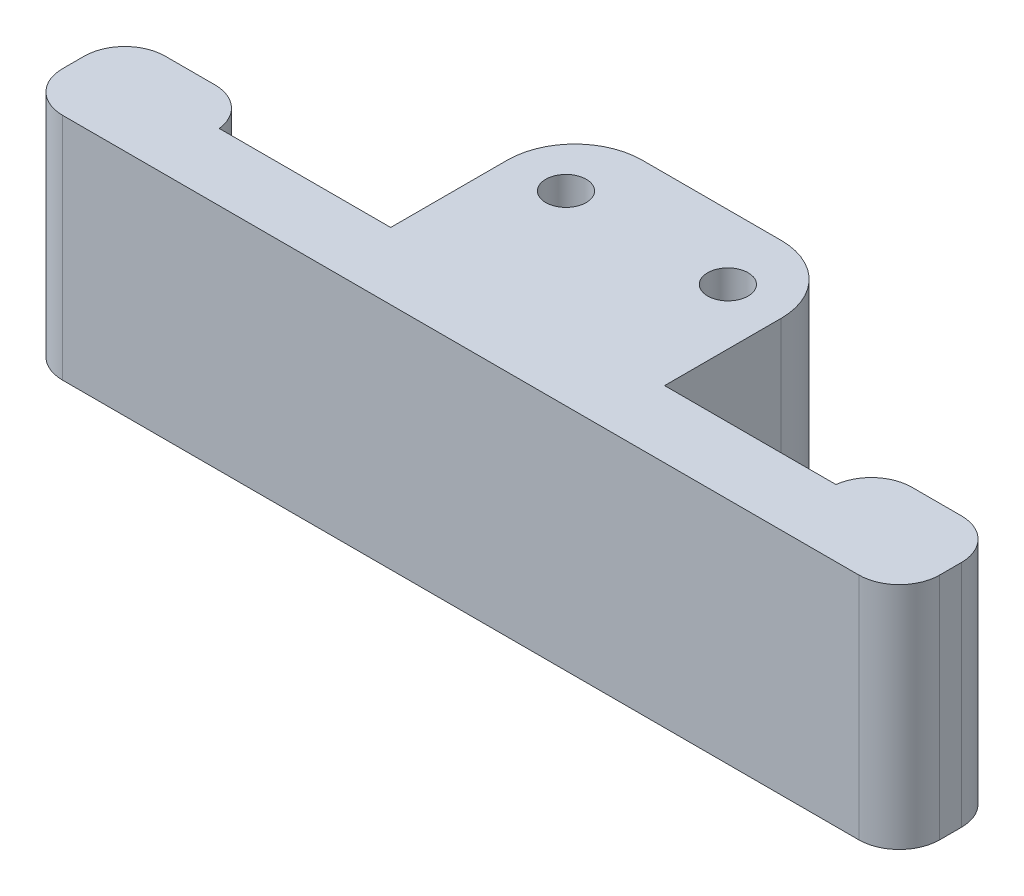
ISO-10303-21;
HEADER;
FILE_DESCRIPTION(('STEP AP214'),'2;1');
FILE_NAME('part.step','',(''),(''),'','','');
FILE_SCHEMA(('AUTOMOTIVE_DESIGN { 1 0 10303 214 1 1 1 1 }'));
ENDSEC;
DATA;
#1=APPLICATION_CONTEXT('core data for automotive mechanical design processes');
#2=APPLICATION_PROTOCOL_DEFINITION('international standard','automotive_design',2000,#1);
#3=PRODUCT_CONTEXT('',#1,'mechanical');
#4=PRODUCT('Part','Part','',(#3));
#5=PRODUCT_RELATED_PRODUCT_CATEGORY('part','',(#4));
#6=PRODUCT_DEFINITION_FORMATION('','',#4);
#7=PRODUCT_DEFINITION_CONTEXT('part definition',#1,'design');
#8=PRODUCT_DEFINITION('design','',#6,#7);
#9=PRODUCT_DEFINITION_SHAPE('','',#8);
#10=(LENGTH_UNIT() NAMED_UNIT(*) SI_UNIT(.MILLI.,.METRE.));
#11=(NAMED_UNIT(*) PLANE_ANGLE_UNIT() SI_UNIT($,.RADIAN.));
#12=(NAMED_UNIT(*) SI_UNIT($,.STERADIAN.) SOLID_ANGLE_UNIT());
#13=UNCERTAINTY_MEASURE_WITH_UNIT(LENGTH_MEASURE(1.E-05),#10,'distance_accuracy_value','');
#14=(GEOMETRIC_REPRESENTATION_CONTEXT(3) GLOBAL_UNCERTAINTY_ASSIGNED_CONTEXT((#13)) GLOBAL_UNIT_ASSIGNED_CONTEXT((#10,
#11,#12)) REPRESENTATION_CONTEXT('',''));
#15=CARTESIAN_POINT('',(0.,0.,0.));
#16=DIRECTION('',(0.,0.,1.));
#17=DIRECTION('',(1.,0.,0.));
#18=AXIS2_PLACEMENT_3D('',#15,#16,#17);
#19=CARTESIAN_POINT('',(0.,17.,0.));
#20=DIRECTION('',(0.,-1.,0.));
#21=DIRECTION('',(0.,0.,-1.));
#22=AXIS2_PLACEMENT_3D('',#19,#20,#21);
#23=PLANE('',#22);
#24=DIRECTION('',(0.,0.,1.));
#25=VECTOR('',#24,1.);
#26=CARTESIAN_POINT('',(-32.5,17.,6.19999999999999));
#27=LINE('',#26,#25);
#28=CARTESIAN_POINT('',(-32.5,17.,9.19999999999999));
#29=VERTEX_POINT('',#28);
#30=CARTESIAN_POINT('',(-32.5,17.,10.8));
#31=VERTEX_POINT('',#30);
#32=EDGE_CURVE('E218',#29,#31,#27,.T.);
#33=ORIENTED_EDGE('',*,*,#32,.T.);
#34=CARTESIAN_POINT('',(-29.5,17.,10.8));
#35=DIRECTION('',(0.,-1.,0.));
#36=DIRECTION('',(0.,0.,-1.));
#37=AXIS2_PLACEMENT_3D('',#34,#35,#36);
#38=CIRCLE('',#37,3.);
#39=CARTESIAN_POINT('',(-29.5,17.,13.8));
#40=VERTEX_POINT('',#39);
#41=EDGE_CURVE('E199',#31,#40,#38,.F.);
#42=ORIENTED_EDGE('',*,*,#41,.T.);
#43=DIRECTION('',(1.,0.,0.));
#44=VECTOR('',#43,1.);
#45=CARTESIAN_POINT('',(-32.5,17.,13.8));
#46=LINE('',#45,#44);
#47=CARTESIAN_POINT('',(29.5,17.,13.8));
#48=VERTEX_POINT('',#47);
#49=EDGE_CURVE('E305',#40,#48,#46,.T.);
#50=ORIENTED_EDGE('',*,*,#49,.T.);
#51=CARTESIAN_POINT('',(29.5,17.,10.8));
#52=DIRECTION('',(0.,-1.,0.));
#53=DIRECTION('',(0.,0.,-1.));
#54=AXIS2_PLACEMENT_3D('',#51,#52,#53);
#55=CIRCLE('',#54,3.);
#56=CARTESIAN_POINT('',(32.5,17.,10.8));
#57=VERTEX_POINT('',#56);
#58=EDGE_CURVE('E197',#48,#57,#55,.F.);
#59=ORIENTED_EDGE('',*,*,#58,.T.);
#60=DIRECTION('',(0.,0.,-1.));
#61=VECTOR('',#60,1.);
#62=CARTESIAN_POINT('',(32.5,17.,13.8));
#63=LINE('',#62,#61);
#64=CARTESIAN_POINT('',(32.5,17.,9.2));
#65=VERTEX_POINT('',#64);
#66=EDGE_CURVE('E303',#57,#65,#63,.T.);
#67=ORIENTED_EDGE('',*,*,#66,.T.);
#68=CARTESIAN_POINT('',(29.5,17.,9.19999999999999));
#69=DIRECTION('',(0.,-1.,0.));
#70=DIRECTION('',(0.,0.,-1.));
#71=AXIS2_PLACEMENT_3D('',#68,#69,#70);
#72=CIRCLE('',#71,3.);
#73=CARTESIAN_POINT('',(29.5,17.,6.19999999999999));
#74=VERTEX_POINT('',#73);
#75=EDGE_CURVE('E57',#65,#74,#72,.F.);
#76=ORIENTED_EDGE('',*,*,#75,.T.);
#77=DIRECTION('',(-1.,0.,0.));
#78=VECTOR('',#77,1.);
#79=CARTESIAN_POINT('',(32.5,17.,6.19999999999999));
#80=LINE('',#79,#78);
#81=CARTESIAN_POINT('',(25.8283216750378,17.,6.19999999999999));
#82=VERTEX_POINT('',#81);
#83=EDGE_CURVE('E301',#74,#82,#80,.T.);
#84=ORIENTED_EDGE('',*,*,#83,.T.);
#85=CARTESIAN_POINT('',(25.8283216750378,17.,9.19999999999999));
#86=DIRECTION('',(0.,-1.,0.));
#87=DIRECTION('',(0.,0.,-1.));
#88=AXIS2_PLACEMENT_3D('',#85,#86,#87);
#89=CIRCLE('',#88,3.);
#90=CARTESIAN_POINT('',(22.85,17.,8.83999999999999));
#91=VERTEX_POINT('',#90);
#92=EDGE_CURVE('E188',#82,#91,#89,.F.);
#93=ORIENTED_EDGE('',*,*,#92,.T.);
#94=DIRECTION('',(-1.,0.,0.));
#95=VECTOR('',#94,1.);
#96=CARTESIAN_POINT('',(22.85,17.,8.83999999999999));
#97=LINE('',#96,#95);
#98=CARTESIAN_POINT('',(10.15,17.,8.83999999999999));
#99=VERTEX_POINT('',#98);
#100=EDGE_CURVE('E299',#91,#99,#97,.T.);
#101=ORIENTED_EDGE('',*,*,#100,.T.);
#102=DIRECTION('',(0.,0.,-1.));
#103=VECTOR('',#102,1.);
#104=CARTESIAN_POINT('',(10.15,17.,8.83999999999999));
#105=LINE('',#104,#103);
#106=CARTESIAN_POINT('',(10.15,17.,0.199999999999995));
#107=VERTEX_POINT('',#106);
#108=EDGE_CURVE('E296',#99,#107,#105,.T.);
#109=ORIENTED_EDGE('',*,*,#108,.T.);
#110=CARTESIAN_POINT('',(5.15,17.,0.199999999999994));
#111=DIRECTION('',(0.,-1.,0.));
#112=DIRECTION('',(0.,0.,-1.));
#113=AXIS2_PLACEMENT_3D('',#110,#111,#112);
#114=CIRCLE('',#113,5.);
#115=CARTESIAN_POINT('',(5.15,17.,-4.80000000000001));
#116=VERTEX_POINT('',#115);
#117=EDGE_CURVE('E248',#107,#116,#114,.F.);
#118=ORIENTED_EDGE('',*,*,#117,.T.);
#119=DIRECTION('',(-1.,0.,0.));
#120=VECTOR('',#119,1.);
#121=CARTESIAN_POINT('',(10.15,17.,-4.80000000000001));
#122=LINE('',#121,#120);
#123=CARTESIAN_POINT('',(-5.15,17.,-4.80000000000001));
#124=VERTEX_POINT('',#123);
#125=EDGE_CURVE('E293',#116,#124,#122,.T.);
#126=ORIENTED_EDGE('',*,*,#125,.T.);
#127=CARTESIAN_POINT('',(-5.15,17.,0.199999999999994));
#128=DIRECTION('',(0.,-1.,0.));
#129=DIRECTION('',(0.,0.,-1.));
#130=AXIS2_PLACEMENT_3D('',#127,#128,#129);
#131=CIRCLE('',#130,5.);
#132=CARTESIAN_POINT('',(-10.15,17.,0.199999999999993));
#133=VERTEX_POINT('',#132);
#134=EDGE_CURVE('E250',#124,#133,#131,.F.);
#135=ORIENTED_EDGE('',*,*,#134,.T.);
#136=DIRECTION('',(0.,0.,1.));
#137=VECTOR('',#136,1.);
#138=CARTESIAN_POINT('',(-10.15,17.,-4.80000000000001));
#139=LINE('',#138,#137);
#140=CARTESIAN_POINT('',(-10.15,17.,8.83999999999999));
#141=VERTEX_POINT('',#140);
#142=EDGE_CURVE('E169',#133,#141,#139,.T.);
#143=ORIENTED_EDGE('',*,*,#142,.T.);
#144=DIRECTION('',(-1.,0.,0.));
#145=VECTOR('',#144,1.);
#146=CARTESIAN_POINT('',(-10.15,17.,8.83999999999999));
#147=LINE('',#146,#145);
#148=CARTESIAN_POINT('',(-22.85,17.,8.83999999999999));
#149=VERTEX_POINT('',#148);
#150=EDGE_CURVE('E160',#141,#149,#147,.T.);
#151=ORIENTED_EDGE('',*,*,#150,.T.);
#152=CARTESIAN_POINT('',(-25.8283216750378,17.,9.19999999999999));
#153=DIRECTION('',(0.,-1.,0.));
#154=DIRECTION('',(0.,0.,-1.));
#155=AXIS2_PLACEMENT_3D('',#152,#153,#154);
#156=CIRCLE('',#155,3.);
#157=CARTESIAN_POINT('',(-25.8283216750378,17.,6.19999999999999));
#158=VERTEX_POINT('',#157);
#159=EDGE_CURVE('E166',#149,#158,#156,.F.);
#160=ORIENTED_EDGE('',*,*,#159,.T.);
#161=DIRECTION('',(-1.,0.,0.));
#162=VECTOR('',#161,1.);
#163=CARTESIAN_POINT('',(-22.85,17.,6.19999999999999));
#164=LINE('',#163,#162);
#165=CARTESIAN_POINT('',(-29.5,17.,6.19999999999999));
#166=VERTEX_POINT('',#165);
#167=EDGE_CURVE('E173',#158,#166,#164,.T.);
#168=ORIENTED_EDGE('',*,*,#167,.T.);
#169=CARTESIAN_POINT('',(-29.5,17.,9.19999999999999));
#170=DIRECTION('',(0.,-1.,0.));
#171=DIRECTION('',(0.,0.,-1.));
#172=AXIS2_PLACEMENT_3D('',#169,#170,#171);
#173=CIRCLE('',#172,3.);
#174=EDGE_CURVE('E189',#166,#29,#173,.F.);
#175=ORIENTED_EDGE('',*,*,#174,.T.);
#176=EDGE_LOOP('',(#33,#42,#50,#59,#67,#76,#84,#93,#101,#109,#118,#126,#135,#143,#151,#160,#168,#175));
#177=FACE_BOUND('',#176,.T.);
#178=CARTESIAN_POINT('',(-6.,17.,0.));
#179=DIRECTION('',(0.,1.,0.));
#180=DIRECTION('',(0.,0.,1.));
#181=AXIS2_PLACEMENT_3D('',#178,#179,#180);
#182=CIRCLE('',#181,1.5);
#183=CARTESIAN_POINT('',(-6.,17.,1.5));
#184=VERTEX_POINT('',#183);
#185=EDGE_CURVE('E291',#184,#184,#182,.T.);
#186=ORIENTED_EDGE('',*,*,#185,.F.);
#187=EDGE_LOOP('',(#186));
#188=FACE_BOUND('',#187,.T.);
#189=CARTESIAN_POINT('',(6.,17.,0.));
#190=DIRECTION('',(0.,1.,0.));
#191=DIRECTION('',(0.,0.,1.));
#192=AXIS2_PLACEMENT_3D('',#189,#190,#191);
#193=CIRCLE('',#192,1.5);
#194=CARTESIAN_POINT('',(6.,17.,1.5));
#195=VERTEX_POINT('',#194);
#196=EDGE_CURVE('E312',#195,#195,#193,.T.);
#197=ORIENTED_EDGE('',*,*,#196,.F.);
#198=EDGE_LOOP('',(#197));
#199=FACE_BOUND('',#198,.T.);
#200=ADVANCED_FACE('F35',(#177,#188,#199),#23,.F.);
#201=CARTESIAN_POINT('',(0.,0.,0.));
#202=DIRECTION('',(0.,-1.,0.));
#203=DIRECTION('',(0.,0.,-1.));
#204=AXIS2_PLACEMENT_3D('',#201,#202,#203);
#205=PLANE('',#204);
#206=CARTESIAN_POINT('',(29.9,0.,9.99999999999999));
#207=DIRECTION('',(0.,-1.,0.));
#208=DIRECTION('',(0.,0.,-1.));
#209=AXIS2_PLACEMENT_3D('',#206,#207,#208);
#210=CIRCLE('',#209,1.);
#211=CARTESIAN_POINT('',(29.9,0.,8.99999999999999));
#212=VERTEX_POINT('',#211);
#213=EDGE_CURVE('E339',#212,#212,#210,.T.);
#214=ORIENTED_EDGE('',*,*,#213,.F.);
#215=EDGE_LOOP('',(#214));
#216=FACE_BOUND('',#215,.T.);
#217=CARTESIAN_POINT('',(3.1,0.,9.99999999999999));
#218=DIRECTION('',(0.,-1.,0.));
#219=DIRECTION('',(0.,0.,-1.));
#220=AXIS2_PLACEMENT_3D('',#217,#218,#219);
#221=CIRCLE('',#220,1.);
#222=CARTESIAN_POINT('',(3.1,0.,8.99999999999999));
#223=VERTEX_POINT('',#222);
#224=EDGE_CURVE('E333',#223,#223,#221,.T.);
#225=ORIENTED_EDGE('',*,*,#224,.F.);
#226=EDGE_LOOP('',(#225));
#227=FACE_BOUND('',#226,.T.);
#228=CARTESIAN_POINT('',(-29.9,0.,9.99999999999999));
#229=DIRECTION('',(0.,-1.,0.));
#230=DIRECTION('',(0.,0.,-1.));
#231=AXIS2_PLACEMENT_3D('',#228,#229,#230);
#232=CIRCLE('',#231,1.);
#233=CARTESIAN_POINT('',(-29.9,0.,8.99999999999999));
#234=VERTEX_POINT('',#233);
#235=EDGE_CURVE('E327',#234,#234,#232,.T.);
#236=ORIENTED_EDGE('',*,*,#235,.F.);
#237=EDGE_LOOP('',(#236));
#238=FACE_BOUND('',#237,.T.);
#239=CARTESIAN_POINT('',(-3.1,0.,9.99999999999999));
#240=DIRECTION('',(0.,-1.,0.));
#241=DIRECTION('',(0.,0.,-1.));
#242=AXIS2_PLACEMENT_3D('',#239,#240,#241);
#243=CIRCLE('',#242,1.);
#244=CARTESIAN_POINT('',(-3.1,0.,8.99999999999999));
#245=VERTEX_POINT('',#244);
#246=EDGE_CURVE('E321',#245,#245,#243,.T.);
#247=ORIENTED_EDGE('',*,*,#246,.F.);
#248=EDGE_LOOP('',(#247));
#249=FACE_BOUND('',#248,.T.);
#250=CARTESIAN_POINT('',(-6.,0.,0.));
#251=DIRECTION('',(0.,1.,0.));
#252=DIRECTION('',(0.,0.,1.));
#253=AXIS2_PLACEMENT_3D('',#250,#251,#252);
#254=CIRCLE('',#253,1.5);
#255=CARTESIAN_POINT('',(-6.,0.,1.5));
#256=VERTEX_POINT('',#255);
#257=EDGE_CURVE('E309',#256,#256,#254,.T.);
#258=ORIENTED_EDGE('',*,*,#257,.T.);
#259=EDGE_LOOP('',(#258));
#260=FACE_BOUND('',#259,.T.);
#261=DIRECTION('',(1.,0.,0.));
#262=VECTOR('',#261,1.);
#263=CARTESIAN_POINT('',(-32.5,0.,13.8));
#264=LINE('',#263,#262);
#265=CARTESIAN_POINT('',(-29.5,0.,13.8));
#266=VERTEX_POINT('',#265);
#267=CARTESIAN_POINT('',(29.5,0.,13.8));
#268=VERTEX_POINT('',#267);
#269=EDGE_CURVE('E284',#266,#268,#264,.T.);
#270=ORIENTED_EDGE('',*,*,#269,.F.);
#271=CARTESIAN_POINT('',(-29.5,0.,10.8));
#272=DIRECTION('',(0.,-1.,0.));
#273=DIRECTION('',(0.,0.,-1.));
#274=AXIS2_PLACEMENT_3D('',#271,#272,#273);
#275=CIRCLE('',#274,3.);
#276=CARTESIAN_POINT('',(-32.5,0.,10.8));
#277=VERTEX_POINT('',#276);
#278=EDGE_CURVE('E227',#266,#277,#275,.T.);
#279=ORIENTED_EDGE('',*,*,#278,.T.);
#280=DIRECTION('',(0.,0.,1.));
#281=VECTOR('',#280,1.);
#282=CARTESIAN_POINT('',(-32.5,0.,6.19999999999999));
#283=LINE('',#282,#281);
#284=CARTESIAN_POINT('',(-32.5,0.,9.19999999999999));
#285=VERTEX_POINT('',#284);
#286=EDGE_CURVE('E287',#285,#277,#283,.T.);
#287=ORIENTED_EDGE('',*,*,#286,.F.);
#288=CARTESIAN_POINT('',(-29.5,0.,9.19999999999999));
#289=DIRECTION('',(0.,-1.,0.));
#290=DIRECTION('',(0.,0.,-1.));
#291=AXIS2_PLACEMENT_3D('',#288,#289,#290);
#292=CIRCLE('',#291,3.);
#293=CARTESIAN_POINT('',(-29.5,0.,6.19999999999999));
#294=VERTEX_POINT('',#293);
#295=EDGE_CURVE('E223',#285,#294,#292,.T.);
#296=ORIENTED_EDGE('',*,*,#295,.T.);
#297=DIRECTION('',(-1.,0.,0.));
#298=VECTOR('',#297,1.);
#299=CARTESIAN_POINT('',(-22.85,0.,6.19999999999999));
#300=LINE('',#299,#298);
#301=CARTESIAN_POINT('',(-25.8283216750378,0.,6.19999999999999));
#302=VERTEX_POINT('',#301);
#303=EDGE_CURVE('E214',#302,#294,#300,.T.);
#304=ORIENTED_EDGE('',*,*,#303,.F.);
#305=CARTESIAN_POINT('',(-25.8283216750378,0.,9.19999999999999));
#306=DIRECTION('',(0.,-1.,0.));
#307=DIRECTION('',(0.,0.,-1.));
#308=AXIS2_PLACEMENT_3D('',#305,#306,#307);
#309=CIRCLE('',#308,3.);
#310=CARTESIAN_POINT('',(-22.85,0.,8.83999999999999));
#311=VERTEX_POINT('',#310);
#312=EDGE_CURVE('E237',#302,#311,#309,.T.);
#313=ORIENTED_EDGE('',*,*,#312,.T.);
#314=DIRECTION('',(-1.,0.,0.));
#315=VECTOR('',#314,1.);
#316=CARTESIAN_POINT('',(-10.15,0.,8.83999999999999));
#317=LINE('',#316,#315);
#318=CARTESIAN_POINT('',(-10.15,0.,8.83999999999999));
#319=VERTEX_POINT('',#318);
#320=EDGE_CURVE('E181',#319,#311,#317,.T.);
#321=ORIENTED_EDGE('',*,*,#320,.F.);
#322=DIRECTION('',(0.,0.,1.));
#323=VECTOR('',#322,1.);
#324=CARTESIAN_POINT('',(-10.15,0.,-4.80000000000001));
#325=LINE('',#324,#323);
#326=CARTESIAN_POINT('',(-10.15,0.,0.199999999999993));
#327=VERTEX_POINT('',#326);
#328=EDGE_CURVE('E174',#327,#319,#325,.T.);
#329=ORIENTED_EDGE('',*,*,#328,.F.);
#330=CARTESIAN_POINT('',(-5.15,0.,0.199999999999994));
#331=DIRECTION('',(0.,-1.,0.));
#332=DIRECTION('',(0.,0.,-1.));
#333=AXIS2_PLACEMENT_3D('',#330,#331,#332);
#334=CIRCLE('',#333,5.);
#335=CARTESIAN_POINT('',(-5.15,0.,-4.80000000000001));
#336=VERTEX_POINT('',#335);
#337=EDGE_CURVE('E256',#327,#336,#334,.T.);
#338=ORIENTED_EDGE('',*,*,#337,.T.);
#339=DIRECTION('',(-1.,0.,0.));
#340=VECTOR('',#339,1.);
#341=CARTESIAN_POINT('',(10.15,0.,-4.80000000000001));
#342=LINE('',#341,#340);
#343=CARTESIAN_POINT('',(5.15,0.,-4.80000000000001));
#344=VERTEX_POINT('',#343);
#345=EDGE_CURVE('E270',#344,#336,#342,.T.);
#346=ORIENTED_EDGE('',*,*,#345,.F.);
#347=CARTESIAN_POINT('',(5.15,0.,0.199999999999994));
#348=DIRECTION('',(0.,-1.,0.));
#349=DIRECTION('',(0.,0.,-1.));
#350=AXIS2_PLACEMENT_3D('',#347,#348,#349);
#351=CIRCLE('',#350,5.);
#352=CARTESIAN_POINT('',(10.15,0.,0.199999999999994));
#353=VERTEX_POINT('',#352);
#354=EDGE_CURVE('E254',#344,#353,#351,.T.);
#355=ORIENTED_EDGE('',*,*,#354,.T.);
#356=DIRECTION('',(0.,0.,-1.));
#357=VECTOR('',#356,1.);
#358=CARTESIAN_POINT('',(10.15,0.,6.19999999999999));
#359=LINE('',#358,#357);
#360=CARTESIAN_POINT('',(10.15,0.,8.83999999999999));
#361=VERTEX_POINT('',#360);
#362=EDGE_CURVE('E273',#361,#353,#359,.T.);
#363=ORIENTED_EDGE('',*,*,#362,.F.);
#364=DIRECTION('',(-1.,0.,0.));
#365=VECTOR('',#364,1.);
#366=CARTESIAN_POINT('',(22.85,0.,8.83999999999999));
#367=LINE('',#366,#365);
#368=CARTESIAN_POINT('',(22.85,0.,8.83999999999999));
#369=VERTEX_POINT('',#368);
#370=EDGE_CURVE('E276',#369,#361,#367,.T.);
#371=ORIENTED_EDGE('',*,*,#370,.F.);
#372=CARTESIAN_POINT('',(25.8283216750378,0.,9.19999999999999));
#373=DIRECTION('',(0.,-1.,0.));
#374=DIRECTION('',(0.,0.,-1.));
#375=AXIS2_PLACEMENT_3D('',#372,#373,#374);
#376=CIRCLE('',#375,3.);
#377=CARTESIAN_POINT('',(25.8283216750378,0.,6.19999999999999));
#378=VERTEX_POINT('',#377);
#379=EDGE_CURVE('E235',#369,#378,#376,.T.);
#380=ORIENTED_EDGE('',*,*,#379,.T.);
#381=DIRECTION('',(-1.,0.,0.));
#382=VECTOR('',#381,1.);
#383=CARTESIAN_POINT('',(32.5,0.,6.19999999999999));
#384=LINE('',#383,#382);
#385=CARTESIAN_POINT('',(29.5,0.,6.19999999999999));
#386=VERTEX_POINT('',#385);
#387=EDGE_CURVE('E279',#386,#378,#384,.T.);
#388=ORIENTED_EDGE('',*,*,#387,.F.);
#389=CARTESIAN_POINT('',(29.5,0.,9.19999999999999));
#390=DIRECTION('',(0.,-1.,0.));
#391=DIRECTION('',(0.,0.,-1.));
#392=AXIS2_PLACEMENT_3D('',#389,#390,#391);
#393=CIRCLE('',#392,3.);
#394=CARTESIAN_POINT('',(32.5,0.,9.2));
#395=VERTEX_POINT('',#394);
#396=EDGE_CURVE('E233',#386,#395,#393,.T.);
#397=ORIENTED_EDGE('',*,*,#396,.T.);
#398=DIRECTION('',(0.,0.,-1.));
#399=VECTOR('',#398,1.);
#400=CARTESIAN_POINT('',(32.5,0.,13.8));
#401=LINE('',#400,#399);
#402=CARTESIAN_POINT('',(32.5,0.,10.8));
#403=VERTEX_POINT('',#402);
#404=EDGE_CURVE('E281',#403,#395,#401,.T.);
#405=ORIENTED_EDGE('',*,*,#404,.F.);
#406=CARTESIAN_POINT('',(29.5,0.,10.8));
#407=DIRECTION('',(0.,-1.,0.));
#408=DIRECTION('',(0.,0.,-1.));
#409=AXIS2_PLACEMENT_3D('',#406,#407,#408);
#410=CIRCLE('',#409,3.);
#411=EDGE_CURVE('E229',#403,#268,#410,.T.);
#412=ORIENTED_EDGE('',*,*,#411,.T.);
#413=EDGE_LOOP('',(#270,#279,#287,#296,#304,#313,#321,#329,#338,#346,#355,#363,#371,#380,#388,
#397,#405,#412));
#414=FACE_BOUND('',#413,.T.);
#415=CARTESIAN_POINT('',(6.,0.,0.));
#416=DIRECTION('',(0.,1.,0.));
#417=DIRECTION('',(0.,0.,1.));
#418=AXIS2_PLACEMENT_3D('',#415,#416,#417);
#419=CIRCLE('',#418,1.5);
#420=CARTESIAN_POINT('',(6.,0.,1.5));
#421=VERTEX_POINT('',#420);
#422=EDGE_CURVE('E315',#421,#421,#419,.T.);
#423=ORIENTED_EDGE('',*,*,#422,.T.);
#424=EDGE_LOOP('',(#423));
#425=FACE_BOUND('',#424,.T.);
#426=ADVANCED_FACE('F354',(#216,#227,#238,#249,#260,#414,#425),#205,.T.);
#427=CARTESIAN_POINT('',(-10.15,17.,8.83999999999999));
#428=DIRECTION('',(0.,0.,1.));
#429=DIRECTION('',(1.,0.,0.));
#430=AXIS2_PLACEMENT_3D('',#427,#428,#429);
#431=PLANE('',#430);
#432=ORIENTED_EDGE('',*,*,#320,.T.);
#433=DIRECTION('',(0.,-1.,0.));
#434=VECTOR('',#433,1.);
#435=CARTESIAN_POINT('',(-22.85,17.,8.83999999999999));
#436=LINE('',#435,#434);
#437=EDGE_CURVE('E178',#149,#311,#436,.T.);
#438=ORIENTED_EDGE('',*,*,#437,.F.);
#439=ORIENTED_EDGE('',*,*,#150,.F.);
#440=DIRECTION('',(0.,-1.,0.));
#441=VECTOR('',#440,1.);
#442=CARTESIAN_POINT('',(-10.15,17.,8.83999999999999));
#443=LINE('',#442,#441);
#444=EDGE_CURVE('E267',#141,#319,#443,.T.);
#445=ORIENTED_EDGE('',*,*,#444,.T.);
#446=EDGE_LOOP('',(#432,#438,#439,#445));
#447=FACE_BOUND('',#446,.T.);
#448=ADVANCED_FACE('F179',(#447),#431,.F.);
#449=CARTESIAN_POINT('',(-22.85,17.,6.19999999999999));
#450=DIRECTION('',(0.,0.,1.));
#451=DIRECTION('',(1.,0.,0.));
#452=AXIS2_PLACEMENT_3D('',#449,#450,#451);
#453=PLANE('',#452);
#454=ORIENTED_EDGE('',*,*,#167,.F.);
#455=DIRECTION('',(0.,1.,0.));
#456=VECTOR('',#455,1.);
#457=CARTESIAN_POINT('',(-25.8283216750378,17.,6.19999999999999));
#458=LINE('',#457,#456);
#459=EDGE_CURVE('E11',#158,#302,#458,.F.);
#460=ORIENTED_EDGE('',*,*,#459,.T.);
#461=ORIENTED_EDGE('',*,*,#303,.T.);
#462=DIRECTION('',(0.,-1.,0.));
#463=VECTOR('',#462,1.);
#464=CARTESIAN_POINT('',(-29.5,17.,6.19999999999999));
#465=LINE('',#464,#463);
#466=EDGE_CURVE('E43',#294,#166,#465,.F.);
#467=ORIENTED_EDGE('',*,*,#466,.T.);
#468=EDGE_LOOP('',(#454,#460,#461,#467));
#469=FACE_BOUND('',#468,.T.);
#470=ADVANCED_FACE('F212',(#469),#453,.F.);
#471=CARTESIAN_POINT('',(-32.5,17.,6.19999999999999));
#472=DIRECTION('',(1.,0.,0.));
#473=DIRECTION('',(0.,0.,-1.));
#474=AXIS2_PLACEMENT_3D('',#471,#472,#473);
#475=PLANE('',#474);
#476=ORIENTED_EDGE('',*,*,#286,.T.);
#477=DIRECTION('',(0.,-1.,0.));
#478=VECTOR('',#477,1.);
#479=CARTESIAN_POINT('',(-32.5,17.,10.8));
#480=LINE('',#479,#478);
#481=EDGE_CURVE('E192',#277,#31,#480,.F.);
#482=ORIENTED_EDGE('',*,*,#481,.T.);
#483=ORIENTED_EDGE('',*,*,#32,.F.);
#484=DIRECTION('',(0.,-1.,0.));
#485=VECTOR('',#484,1.);
#486=CARTESIAN_POINT('',(-32.5,17.,9.19999999999999));
#487=LINE('',#486,#485);
#488=EDGE_CURVE('E222',#29,#285,#487,.T.);
#489=ORIENTED_EDGE('',*,*,#488,.T.);
#490=EDGE_LOOP('',(#476,#482,#483,#489));
#491=FACE_BOUND('',#490,.T.);
#492=ADVANCED_FACE('F417',(#491),#475,.F.);
#493=CARTESIAN_POINT('',(-32.5,17.,13.8));
#494=DIRECTION('',(0.,0.,-1.));
#495=DIRECTION('',(-1.,0.,0.));
#496=AXIS2_PLACEMENT_3D('',#493,#494,#495);
#497=PLANE('',#496);
#498=ORIENTED_EDGE('',*,*,#49,.F.);
#499=DIRECTION('',(0.,-1.,0.));
#500=VECTOR('',#499,1.);
#501=CARTESIAN_POINT('',(-29.5,17.,13.8));
#502=LINE('',#501,#500);
#503=EDGE_CURVE('E240',#40,#266,#502,.T.);
#504=ORIENTED_EDGE('',*,*,#503,.T.);
#505=ORIENTED_EDGE('',*,*,#269,.T.);
#506=DIRECTION('',(0.,-1.,0.));
#507=VECTOR('',#506,1.);
#508=CARTESIAN_POINT('',(29.5,17.,13.8));
#509=LINE('',#508,#507);
#510=EDGE_CURVE('E243',#268,#48,#509,.F.);
#511=ORIENTED_EDGE('',*,*,#510,.T.);
#512=EDGE_LOOP('',(#498,#504,#505,#511));
#513=FACE_BOUND('',#512,.T.);
#514=ADVANCED_FACE('F413',(#513),#497,.F.);
#515=CARTESIAN_POINT('',(32.5,17.,13.8));
#516=DIRECTION('',(-1.,0.,0.));
#517=DIRECTION('',(0.,0.,1.));
#518=AXIS2_PLACEMENT_3D('',#515,#516,#517);
#519=PLANE('',#518);
#520=ORIENTED_EDGE('',*,*,#66,.F.);
#521=DIRECTION('',(0.,-1.,0.));
#522=VECTOR('',#521,1.);
#523=CARTESIAN_POINT('',(32.5,17.,10.8));
#524=LINE('',#523,#522);
#525=EDGE_CURVE('E203',#57,#403,#524,.T.);
#526=ORIENTED_EDGE('',*,*,#525,.T.);
#527=ORIENTED_EDGE('',*,*,#404,.T.);
#528=DIRECTION('',(0.,-1.,0.));
#529=VECTOR('',#528,1.);
#530=CARTESIAN_POINT('',(32.5,17.,9.19999999999999));
#531=LINE('',#530,#529);
#532=EDGE_CURVE('E201',#395,#65,#531,.F.);
#533=ORIENTED_EDGE('',*,*,#532,.T.);
#534=EDGE_LOOP('',(#520,#526,#527,#533));
#535=FACE_BOUND('',#534,.T.);
#536=ADVANCED_FACE('F410',(#535),#519,.F.);
#537=CARTESIAN_POINT('',(32.5,17.,6.19999999999999));
#538=DIRECTION('',(0.,0.,1.));
#539=DIRECTION('',(1.,0.,0.));
#540=AXIS2_PLACEMENT_3D('',#537,#538,#539);
#541=PLANE('',#540);
#542=ORIENTED_EDGE('',*,*,#83,.F.);
#543=DIRECTION('',(0.,-1.,0.));
#544=VECTOR('',#543,1.);
#545=CARTESIAN_POINT('',(29.5,17.,6.19999999999999));
#546=LINE('',#545,#544);
#547=EDGE_CURVE('E207',#74,#386,#546,.T.);
#548=ORIENTED_EDGE('',*,*,#547,.T.);
#549=ORIENTED_EDGE('',*,*,#387,.T.);
#550=DIRECTION('',(0.,-1.,0.));
#551=VECTOR('',#550,1.);
#552=CARTESIAN_POINT('',(25.8283216750378,17.,6.19999999999999));
#553=LINE('',#552,#551);
#554=EDGE_CURVE('E50',#378,#82,#553,.F.);
#555=ORIENTED_EDGE('',*,*,#554,.T.);
#556=EDGE_LOOP('',(#542,#548,#549,#555));
#557=FACE_BOUND('',#556,.T.);
#558=ADVANCED_FACE('F406',(#557),#541,.F.);
#559=CARTESIAN_POINT('',(22.85,17.,8.83999999999999));
#560=DIRECTION('',(0.,0.,1.));
#561=DIRECTION('',(1.,0.,0.));
#562=AXIS2_PLACEMENT_3D('',#559,#560,#561);
#563=PLANE('',#562);
#564=ORIENTED_EDGE('',*,*,#370,.T.);
#565=DIRECTION('',(0.,-1.,0.));
#566=VECTOR('',#565,1.);
#567=CARTESIAN_POINT('',(10.15,17.,8.83999999999999));
#568=LINE('',#567,#566);
#569=EDGE_CURVE('E264',#99,#361,#568,.T.);
#570=ORIENTED_EDGE('',*,*,#569,.F.);
#571=ORIENTED_EDGE('',*,*,#100,.F.);
#572=DIRECTION('',(0.,-1.,0.));
#573=VECTOR('',#572,1.);
#574=CARTESIAN_POINT('',(22.85,17.,8.83999999999999));
#575=LINE('',#574,#573);
#576=EDGE_CURVE('E184',#91,#369,#575,.T.);
#577=ORIENTED_EDGE('',*,*,#576,.T.);
#578=EDGE_LOOP('',(#564,#570,#571,#577));
#579=FACE_BOUND('',#578,.T.);
#580=ADVANCED_FACE('F402',(#579),#563,.F.);
#581=CARTESIAN_POINT('',(10.15,17.,6.19999999999999));
#582=DIRECTION('',(-1.,0.,0.));
#583=DIRECTION('',(0.,0.,1.));
#584=AXIS2_PLACEMENT_3D('',#581,#582,#583);
#585=PLANE('',#584);
#586=ORIENTED_EDGE('',*,*,#362,.T.);
#587=DIRECTION('',(0.,-1.,0.));
#588=VECTOR('',#587,1.);
#589=CARTESIAN_POINT('',(10.15,17.,0.199999999999994));
#590=LINE('',#589,#588);
#591=EDGE_CURVE('E252',#353,#107,#590,.F.);
#592=ORIENTED_EDGE('',*,*,#591,.T.);
#593=ORIENTED_EDGE('',*,*,#108,.F.);
#594=ORIENTED_EDGE('',*,*,#569,.T.);
#595=EDGE_LOOP('',(#586,#592,#593,#594));
#596=FACE_BOUND('',#595,.T.);
#597=ADVANCED_FACE('F398',(#596),#585,.F.);
#598=CARTESIAN_POINT('',(10.15,17.,-4.80000000000001));
#599=DIRECTION('',(0.,0.,1.));
#600=DIRECTION('',(1.,0.,0.));
#601=AXIS2_PLACEMENT_3D('',#598,#599,#600);
#602=PLANE('',#601);
#603=ORIENTED_EDGE('',*,*,#125,.F.);
#604=DIRECTION('',(0.,-1.,0.));
#605=VECTOR('',#604,1.);
#606=CARTESIAN_POINT('',(5.15,17.,-4.80000000000001));
#607=LINE('',#606,#605);
#608=EDGE_CURVE('E258',#116,#344,#607,.T.);
#609=ORIENTED_EDGE('',*,*,#608,.T.);
#610=ORIENTED_EDGE('',*,*,#345,.T.);
#611=DIRECTION('',(0.,-1.,0.));
#612=VECTOR('',#611,1.);
#613=CARTESIAN_POINT('',(-5.15,17.,-4.80000000000001));
#614=LINE('',#613,#612);
#615=EDGE_CURVE('E183',#336,#124,#614,.F.);
#616=ORIENTED_EDGE('',*,*,#615,.T.);
#617=EDGE_LOOP('',(#603,#609,#610,#616));
#618=FACE_BOUND('',#617,.T.);
#619=ADVANCED_FACE('F394',(#618),#602,.F.);
#620=CARTESIAN_POINT('',(-10.15,17.,-4.80000000000001));
#621=DIRECTION('',(1.,0.,0.));
#622=DIRECTION('',(0.,0.,-1.));
#623=AXIS2_PLACEMENT_3D('',#620,#621,#622);
#624=PLANE('',#623);
#625=ORIENTED_EDGE('',*,*,#142,.F.);
#626=DIRECTION('',(0.,-1.,0.));
#627=VECTOR('',#626,1.);
#628=CARTESIAN_POINT('',(-10.15,17.,0.199999999999994));
#629=LINE('',#628,#627);
#630=EDGE_CURVE('E245',#133,#327,#629,.T.);
#631=ORIENTED_EDGE('',*,*,#630,.T.);
#632=ORIENTED_EDGE('',*,*,#328,.T.);
#633=ORIENTED_EDGE('',*,*,#444,.F.);
#634=EDGE_LOOP('',(#625,#631,#632,#633));
#635=FACE_BOUND('',#634,.T.);
#636=ADVANCED_FACE('F383',(#635),#624,.F.);
#637=CARTESIAN_POINT('',(-6.,17.,0.));
#638=DIRECTION('',(0.,-1.,0.));
#639=DIRECTION('',(0.,0.,-1.));
#640=AXIS2_PLACEMENT_3D('',#637,#638,#639);
#641=CYLINDRICAL_SURFACE('',#640,1.5);
#642=ORIENTED_EDGE('',*,*,#185,.T.);
#643=EDGE_LOOP('',(#642));
#644=FACE_BOUND('',#643,.T.);
#645=ORIENTED_EDGE('',*,*,#257,.F.);
#646=EDGE_LOOP('',(#645));
#647=FACE_BOUND('',#646,.T.);
#648=ADVANCED_FACE('F373',(#644,#647),#641,.F.);
#649=CARTESIAN_POINT('',(6.,17.,0.));
#650=DIRECTION('',(0.,-1.,0.));
#651=DIRECTION('',(0.,0.,-1.));
#652=AXIS2_PLACEMENT_3D('',#649,#650,#651);
#653=CYLINDRICAL_SURFACE('',#652,1.5);
#654=ORIENTED_EDGE('',*,*,#196,.T.);
#655=EDGE_LOOP('',(#654));
#656=FACE_BOUND('',#655,.T.);
#657=ORIENTED_EDGE('',*,*,#422,.F.);
#658=EDGE_LOOP('',(#657));
#659=FACE_BOUND('',#658,.T.);
#660=ADVANCED_FACE('F370',(#656,#659),#653,.F.);
#661=CARTESIAN_POINT('',(-3.1,12.,9.99999999999999));
#662=DIRECTION('',(0.,-1.,0.));
#663=DIRECTION('',(0.,0.,-1.));
#664=AXIS2_PLACEMENT_3D('',#661,#662,#663);
#665=CYLINDRICAL_SURFACE('',#664,1.);
#666=CARTESIAN_POINT('',(-3.1,12.,9.99999999999999));
#667=DIRECTION('',(0.,-1.,0.));
#668=DIRECTION('',(0.,0.,-1.));
#669=AXIS2_PLACEMENT_3D('',#666,#667,#668);
#670=CIRCLE('',#669,1.);
#671=CARTESIAN_POINT('',(-3.1,12.,8.99999999999999));
#672=VERTEX_POINT('',#671);
#673=EDGE_CURVE('E318',#672,#672,#670,.T.);
#674=ORIENTED_EDGE('',*,*,#673,.F.);
#675=EDGE_LOOP('',(#674));
#676=FACE_BOUND('',#675,.T.);
#677=ORIENTED_EDGE('',*,*,#246,.T.);
#678=EDGE_LOOP('',(#677));
#679=FACE_BOUND('',#678,.T.);
#680=ADVANCED_FACE('F372',(#676,#679),#665,.F.);
#681=CARTESIAN_POINT('',(-3.1,12.,9.99999999999999));
#682=DIRECTION('',(0.,-1.,0.));
#683=DIRECTION('',(0.,0.,-1.));
#684=AXIS2_PLACEMENT_3D('',#681,#682,#683);
#685=PLANE('',#684);
#686=ORIENTED_EDGE('',*,*,#673,.T.);
#687=EDGE_LOOP('',(#686));
#688=FACE_BOUND('',#687,.T.);
#689=ADVANCED_FACE('F380',(#688),#685,.T.);
#690=CARTESIAN_POINT('',(-29.9,12.,9.99999999999999));
#691=DIRECTION('',(0.,-1.,0.));
#692=DIRECTION('',(0.,0.,-1.));
#693=AXIS2_PLACEMENT_3D('',#690,#691,#692);
#694=CYLINDRICAL_SURFACE('',#693,1.);
#695=CARTESIAN_POINT('',(-29.9,12.,9.99999999999999));
#696=DIRECTION('',(0.,-1.,0.));
#697=DIRECTION('',(0.,0.,-1.));
#698=AXIS2_PLACEMENT_3D('',#695,#696,#697);
#699=CIRCLE('',#698,1.);
#700=CARTESIAN_POINT('',(-29.9,12.,8.99999999999999));
#701=VERTEX_POINT('',#700);
#702=EDGE_CURVE('E324',#701,#701,#699,.T.);
#703=ORIENTED_EDGE('',*,*,#702,.F.);
#704=EDGE_LOOP('',(#703));
#705=FACE_BOUND('',#704,.T.);
#706=ORIENTED_EDGE('',*,*,#235,.T.);
#707=EDGE_LOOP('',(#706));
#708=FACE_BOUND('',#707,.T.);
#709=ADVANCED_FACE('F577',(#705,#708),#694,.F.);
#710=CARTESIAN_POINT('',(-29.9,12.,9.99999999999999));
#711=DIRECTION('',(0.,-1.,0.));
#712=DIRECTION('',(0.,0.,-1.));
#713=AXIS2_PLACEMENT_3D('',#710,#711,#712);
#714=PLANE('',#713);
#715=ORIENTED_EDGE('',*,*,#702,.T.);
#716=EDGE_LOOP('',(#715));
#717=FACE_BOUND('',#716,.T.);
#718=ADVANCED_FACE('F586',(#717),#714,.T.);
#719=CARTESIAN_POINT('',(3.1,12.,9.99999999999999));
#720=DIRECTION('',(0.,-1.,0.));
#721=DIRECTION('',(0.,0.,-1.));
#722=AXIS2_PLACEMENT_3D('',#719,#720,#721);
#723=CYLINDRICAL_SURFACE('',#722,1.);
#724=CARTESIAN_POINT('',(3.1,12.,9.99999999999999));
#725=DIRECTION('',(0.,-1.,0.));
#726=DIRECTION('',(0.,0.,-1.));
#727=AXIS2_PLACEMENT_3D('',#724,#725,#726);
#728=CIRCLE('',#727,1.);
#729=CARTESIAN_POINT('',(3.1,12.,8.99999999999999));
#730=VERTEX_POINT('',#729);
#731=EDGE_CURVE('E330',#730,#730,#728,.T.);
#732=ORIENTED_EDGE('',*,*,#731,.F.);
#733=EDGE_LOOP('',(#732));
#734=FACE_BOUND('',#733,.T.);
#735=ORIENTED_EDGE('',*,*,#224,.T.);
#736=EDGE_LOOP('',(#735));
#737=FACE_BOUND('',#736,.T.);
#738=ADVANCED_FACE('F595',(#734,#737),#723,.F.);
#739=CARTESIAN_POINT('',(3.1,12.,9.99999999999999));
#740=DIRECTION('',(0.,-1.,0.));
#741=DIRECTION('',(0.,0.,-1.));
#742=AXIS2_PLACEMENT_3D('',#739,#740,#741);
#743=PLANE('',#742);
#744=ORIENTED_EDGE('',*,*,#731,.T.);
#745=EDGE_LOOP('',(#744));
#746=FACE_BOUND('',#745,.T.);
#747=ADVANCED_FACE('F350',(#746),#743,.T.);
#748=CARTESIAN_POINT('',(29.9,12.,9.99999999999999));
#749=DIRECTION('',(0.,-1.,0.));
#750=DIRECTION('',(0.,0.,-1.));
#751=AXIS2_PLACEMENT_3D('',#748,#749,#750);
#752=CYLINDRICAL_SURFACE('',#751,1.);
#753=CARTESIAN_POINT('',(29.9,12.,9.99999999999999));
#754=DIRECTION('',(0.,-1.,0.));
#755=DIRECTION('',(0.,0.,-1.));
#756=AXIS2_PLACEMENT_3D('',#753,#754,#755);
#757=CIRCLE('',#756,1.);
#758=CARTESIAN_POINT('',(29.9,12.,8.99999999999999));
#759=VERTEX_POINT('',#758);
#760=EDGE_CURVE('E336',#759,#759,#757,.T.);
#761=ORIENTED_EDGE('',*,*,#760,.F.);
#762=EDGE_LOOP('',(#761));
#763=FACE_BOUND('',#762,.T.);
#764=ORIENTED_EDGE('',*,*,#213,.T.);
#765=EDGE_LOOP('',(#764));
#766=FACE_BOUND('',#765,.T.);
#767=ADVANCED_FACE('F347',(#763,#766),#752,.F.);
#768=CARTESIAN_POINT('',(29.9,12.,9.99999999999999));
#769=DIRECTION('',(0.,-1.,0.));
#770=DIRECTION('',(0.,0.,-1.));
#771=AXIS2_PLACEMENT_3D('',#768,#769,#770);
#772=PLANE('',#771);
#773=ORIENTED_EDGE('',*,*,#760,.T.);
#774=EDGE_LOOP('',(#773));
#775=FACE_BOUND('',#774,.T.);
#776=ADVANCED_FACE('F345',(#775),#772,.T.);
#777=CARTESIAN_POINT('',(5.15,17.,0.199999999999994));
#778=DIRECTION('',(0.,-1.,0.));
#779=DIRECTION('',(0.,0.,-1.));
#780=AXIS2_PLACEMENT_3D('',#777,#778,#779);
#781=CYLINDRICAL_SURFACE('',#780,5.);
#782=ORIENTED_EDGE('',*,*,#117,.F.);
#783=ORIENTED_EDGE('',*,*,#591,.F.);
#784=ORIENTED_EDGE('',*,*,#354,.F.);
#785=ORIENTED_EDGE('',*,*,#608,.F.);
#786=EDGE_LOOP('',(#782,#783,#784,#785));
#787=FACE_BOUND('',#786,.T.);
#788=ADVANCED_FACE('F425',(#787),#781,.T.);
#789=CARTESIAN_POINT('',(-5.15,17.,0.199999999999994));
#790=DIRECTION('',(0.,-1.,0.));
#791=DIRECTION('',(0.,0.,-1.));
#792=AXIS2_PLACEMENT_3D('',#789,#790,#791);
#793=CYLINDRICAL_SURFACE('',#792,5.);
#794=ORIENTED_EDGE('',*,*,#134,.F.);
#795=ORIENTED_EDGE('',*,*,#615,.F.);
#796=ORIENTED_EDGE('',*,*,#337,.F.);
#797=ORIENTED_EDGE('',*,*,#630,.F.);
#798=EDGE_LOOP('',(#794,#795,#796,#797));
#799=FACE_BOUND('',#798,.T.);
#800=ADVANCED_FACE('F428',(#799),#793,.T.);
#801=CARTESIAN_POINT('',(-29.5,17.,10.8));
#802=DIRECTION('',(0.,-1.,0.));
#803=DIRECTION('',(0.,0.,-1.));
#804=AXIS2_PLACEMENT_3D('',#801,#802,#803);
#805=CYLINDRICAL_SURFACE('',#804,3.);
#806=ORIENTED_EDGE('',*,*,#41,.F.);
#807=ORIENTED_EDGE('',*,*,#481,.F.);
#808=ORIENTED_EDGE('',*,*,#278,.F.);
#809=ORIENTED_EDGE('',*,*,#503,.F.);
#810=EDGE_LOOP('',(#806,#807,#808,#809));
#811=FACE_BOUND('',#810,.T.);
#812=ADVANCED_FACE('F432',(#811),#805,.T.);
#813=CARTESIAN_POINT('',(29.5,17.,10.8));
#814=DIRECTION('',(0.,-1.,0.));
#815=DIRECTION('',(0.,0.,-1.));
#816=AXIS2_PLACEMENT_3D('',#813,#814,#815);
#817=CYLINDRICAL_SURFACE('',#816,3.);
#818=ORIENTED_EDGE('',*,*,#58,.F.);
#819=ORIENTED_EDGE('',*,*,#510,.F.);
#820=ORIENTED_EDGE('',*,*,#411,.F.);
#821=ORIENTED_EDGE('',*,*,#525,.F.);
#822=EDGE_LOOP('',(#818,#819,#820,#821));
#823=FACE_BOUND('',#822,.T.);
#824=ADVANCED_FACE('F436',(#823),#817,.T.);
#825=CARTESIAN_POINT('',(29.5,17.,9.19999999999999));
#826=DIRECTION('',(0.,-1.,0.));
#827=DIRECTION('',(0.,0.,-1.));
#828=AXIS2_PLACEMENT_3D('',#825,#826,#827);
#829=CYLINDRICAL_SURFACE('',#828,3.);
#830=ORIENTED_EDGE('',*,*,#75,.F.);
#831=ORIENTED_EDGE('',*,*,#532,.F.);
#832=ORIENTED_EDGE('',*,*,#396,.F.);
#833=ORIENTED_EDGE('',*,*,#547,.F.);
#834=EDGE_LOOP('',(#830,#831,#832,#833));
#835=FACE_BOUND('',#834,.T.);
#836=ADVANCED_FACE('F440',(#835),#829,.T.);
#837=CARTESIAN_POINT('',(25.8283216750378,17.,9.19999999999999));
#838=DIRECTION('',(0.,-1.,0.));
#839=DIRECTION('',(0.,0.,-1.));
#840=AXIS2_PLACEMENT_3D('',#837,#838,#839);
#841=CYLINDRICAL_SURFACE('',#840,3.);
#842=ORIENTED_EDGE('',*,*,#92,.F.);
#843=ORIENTED_EDGE('',*,*,#554,.F.);
#844=ORIENTED_EDGE('',*,*,#379,.F.);
#845=ORIENTED_EDGE('',*,*,#576,.F.);
#846=EDGE_LOOP('',(#842,#843,#844,#845));
#847=FACE_BOUND('',#846,.T.);
#848=ADVANCED_FACE('F444',(#847),#841,.T.);
#849=CARTESIAN_POINT('',(-25.8283216750378,17.,9.19999999999999));
#850=DIRECTION('',(0.,1.,0.));
#851=DIRECTION('',(0.,0.,1.));
#852=AXIS2_PLACEMENT_3D('',#849,#850,#851);
#853=CYLINDRICAL_SURFACE('',#852,3.);
#854=ORIENTED_EDGE('',*,*,#159,.F.);
#855=ORIENTED_EDGE('',*,*,#437,.T.);
#856=ORIENTED_EDGE('',*,*,#312,.F.);
#857=ORIENTED_EDGE('',*,*,#459,.F.);
#858=EDGE_LOOP('',(#854,#855,#856,#857));
#859=FACE_BOUND('',#858,.T.);
#860=ADVANCED_FACE('F187',(#859),#853,.T.);
#861=CARTESIAN_POINT('',(-29.5,17.,9.19999999999999));
#862=DIRECTION('',(0.,-1.,0.));
#863=DIRECTION('',(0.,0.,-1.));
#864=AXIS2_PLACEMENT_3D('',#861,#862,#863);
#865=CYLINDRICAL_SURFACE('',#864,3.);
#866=ORIENTED_EDGE('',*,*,#174,.F.);
#867=ORIENTED_EDGE('',*,*,#466,.F.);
#868=ORIENTED_EDGE('',*,*,#295,.F.);
#869=ORIENTED_EDGE('',*,*,#488,.F.);
#870=EDGE_LOOP('',(#866,#867,#868,#869));
#871=FACE_BOUND('',#870,.T.);
#872=ADVANCED_FACE('F37',(#871),#865,.T.);
#873=CLOSED_SHELL('',(#200,#426,#448,#470,#492,#514,#536,#558,#580,#597,#619,#636,#648,#660,
#680,#689,#709,#718,#738,#747,#767,#776,#788,#800,#812,#824,#836,#848,#860,#872));
#874=MANIFOLD_SOLID_BREP('B2',#873);
#875=ADVANCED_BREP_SHAPE_REPRESENTATION('',(#18,#874),#14);
#876=SHAPE_DEFINITION_REPRESENTATION(#9,#875);
ENDSEC;
END-ISO-10303-21;
